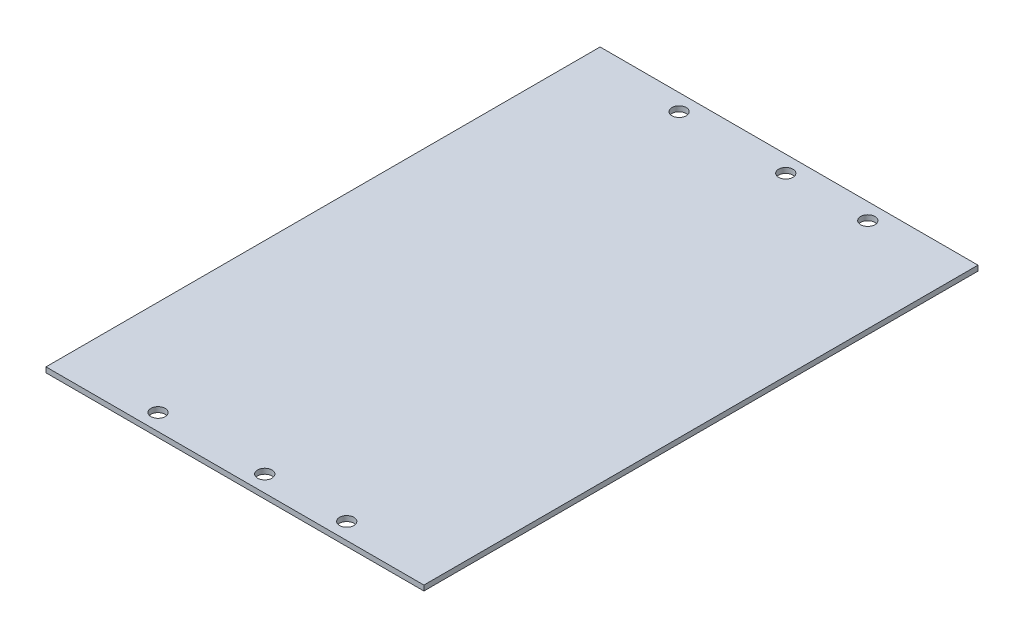
ISO-10303-21;
HEADER;
FILE_DESCRIPTION(('STEP AP214'),'2;1');
FILE_NAME('part.step','',(''),(''),'','','');
FILE_SCHEMA(('AUTOMOTIVE_DESIGN { 1 0 10303 214 1 1 1 1 }'));
ENDSEC;
DATA;
#1=APPLICATION_CONTEXT('core data for automotive mechanical design processes');
#2=APPLICATION_PROTOCOL_DEFINITION('international standard','automotive_design',2000,#1);
#3=PRODUCT_CONTEXT('',#1,'mechanical');
#4=PRODUCT('Part','Part','',(#3));
#5=PRODUCT_RELATED_PRODUCT_CATEGORY('part','',(#4));
#6=PRODUCT_DEFINITION_FORMATION('','',#4);
#7=PRODUCT_DEFINITION_CONTEXT('part definition',#1,'design');
#8=PRODUCT_DEFINITION('design','',#6,#7);
#9=PRODUCT_DEFINITION_SHAPE('','',#8);
#10=(LENGTH_UNIT() NAMED_UNIT(*) SI_UNIT(.MILLI.,.METRE.));
#11=(NAMED_UNIT(*) PLANE_ANGLE_UNIT() SI_UNIT($,.RADIAN.));
#12=(NAMED_UNIT(*) SI_UNIT($,.STERADIAN.) SOLID_ANGLE_UNIT());
#13=UNCERTAINTY_MEASURE_WITH_UNIT(LENGTH_MEASURE(1.E-05),#10,'distance_accuracy_value','');
#14=(GEOMETRIC_REPRESENTATION_CONTEXT(3) GLOBAL_UNCERTAINTY_ASSIGNED_CONTEXT((#13)) GLOBAL_UNIT_ASSIGNED_CONTEXT((#10,
#11,#12)) REPRESENTATION_CONTEXT('',''));
#15=CARTESIAN_POINT('',(0.,0.,0.));
#16=DIRECTION('',(0.,0.,1.));
#17=DIRECTION('',(1.,0.,0.));
#18=AXIS2_PLACEMENT_3D('',#15,#16,#17);
#19=CARTESIAN_POINT('',(0.,2.,0.));
#20=DIRECTION('',(0.,-1.,0.));
#21=DIRECTION('',(0.,0.,-1.));
#22=AXIS2_PLACEMENT_3D('',#19,#20,#21);
#23=PLANE('',#22);
#24=DIRECTION('',(0.,0.,1.));
#25=VECTOR('',#24,1.);
#26=CARTESIAN_POINT('',(5.70000000000018,2.,-1.4050000000001));
#27=LINE('',#26,#25);
#28=CARTESIAN_POINT('',(5.70000000000028,2.,-214.3));
#29=VERTEX_POINT('',#28);
#30=CARTESIAN_POINT('',(5.70000000000018,2.,-1.4050000000001));
#31=VERTEX_POINT('',#30);
#32=EDGE_CURVE('E91',#29,#31,#27,.T.);
#33=ORIENTED_EDGE('',*,*,#32,.T.);
#34=DIRECTION('',(1.,0.,0.));
#35=VECTOR('',#34,1.);
#36=CARTESIAN_POINT('',(5.70000000000018,2.,-1.4050000000001));
#37=LINE('',#36,#35);
#38=CARTESIAN_POINT('',(150.9,2.,-1.4050000000001));
#39=VERTEX_POINT('',#38);
#40=EDGE_CURVE('E86',#31,#39,#37,.T.);
#41=ORIENTED_EDGE('',*,*,#40,.T.);
#42=DIRECTION('',(0.,0.,-1.));
#43=VECTOR('',#42,1.);
#44=CARTESIAN_POINT('',(150.9,2.,-1.4050000000001));
#45=LINE('',#44,#43);
#46=CARTESIAN_POINT('',(150.9,2.,-214.3));
#47=VERTEX_POINT('',#46);
#48=EDGE_CURVE('E89',#39,#47,#45,.T.);
#49=ORIENTED_EDGE('',*,*,#48,.T.);
#50=DIRECTION('',(-1.,0.,0.));
#51=VECTOR('',#50,1.);
#52=CARTESIAN_POINT('',(5.70000000000028,2.,-214.3));
#53=LINE('',#52,#51);
#54=EDGE_CURVE('E56',#47,#29,#53,.T.);
#55=ORIENTED_EDGE('',*,*,#54,.T.);
#56=EDGE_LOOP('',(#33,#41,#49,#55));
#57=FACE_BOUND('',#56,.T.);
#58=CARTESIAN_POINT('',(42.4000000000003,2.,-207.95));
#59=DIRECTION('',(0.,1.,0.));
#60=DIRECTION('',(0.,0.,1.));
#61=AXIS2_PLACEMENT_3D('',#58,#59,#60);
#62=CIRCLE('',#61,2.75);
#63=CARTESIAN_POINT('',(42.4000000000003,2.,-205.2));
#64=VERTEX_POINT('',#63);
#65=EDGE_CURVE('E106',#64,#64,#62,.T.);
#66=ORIENTED_EDGE('',*,*,#65,.F.);
#67=EDGE_LOOP('',(#66));
#68=FACE_BOUND('',#67,.T.);
#69=CARTESIAN_POINT('',(83.4000000000002,2.,-207.95));
#70=DIRECTION('',(0.,1.,0.));
#71=DIRECTION('',(0.,0.,1.));
#72=AXIS2_PLACEMENT_3D('',#69,#70,#71);
#73=CIRCLE('',#72,2.75000000000001);
#74=CARTESIAN_POINT('',(83.4000000000002,2.,-205.2));
#75=VERTEX_POINT('',#74);
#76=EDGE_CURVE('E121',#75,#75,#73,.T.);
#77=ORIENTED_EDGE('',*,*,#76,.F.);
#78=EDGE_LOOP('',(#77));
#79=FACE_BOUND('',#78,.T.);
#80=CARTESIAN_POINT('',(114.9,2.,-207.95));
#81=DIRECTION('',(0.,1.,0.));
#82=DIRECTION('',(0.,0.,1.));
#83=AXIS2_PLACEMENT_3D('',#80,#81,#82);
#84=CIRCLE('',#83,2.75000000000001);
#85=CARTESIAN_POINT('',(114.9,2.,-205.2));
#86=VERTEX_POINT('',#85);
#87=EDGE_CURVE('E127',#86,#86,#84,.T.);
#88=ORIENTED_EDGE('',*,*,#87,.F.);
#89=EDGE_LOOP('',(#88));
#90=FACE_BOUND('',#89,.T.);
#91=CARTESIAN_POINT('',(114.9,2.,-7.75500000000012));
#92=DIRECTION('',(0.,1.,0.));
#93=DIRECTION('',(0.,0.,-1.));
#94=AXIS2_PLACEMENT_3D('',#91,#92,#93);
#95=CIRCLE('',#94,2.75000000000001);
#96=CARTESIAN_POINT('',(114.9,2.,-10.5050000000001));
#97=VERTEX_POINT('',#96);
#98=EDGE_CURVE('E133',#97,#97,#95,.T.);
#99=ORIENTED_EDGE('',*,*,#98,.F.);
#100=EDGE_LOOP('',(#99));
#101=FACE_BOUND('',#100,.T.);
#102=CARTESIAN_POINT('',(83.4000000000001,2.,-7.75500000000012));
#103=DIRECTION('',(0.,1.,0.));
#104=DIRECTION('',(0.,0.,-1.));
#105=AXIS2_PLACEMENT_3D('',#102,#103,#104);
#106=CIRCLE('',#105,2.75000000000001);
#107=CARTESIAN_POINT('',(83.4000000000001,2.,-10.5050000000001));
#108=VERTEX_POINT('',#107);
#109=EDGE_CURVE('E139',#108,#108,#106,.T.);
#110=ORIENTED_EDGE('',*,*,#109,.F.);
#111=EDGE_LOOP('',(#110));
#112=FACE_BOUND('',#111,.T.);
#113=CARTESIAN_POINT('',(42.4000000000003,2.,-7.75500000000012));
#114=DIRECTION('',(0.,1.,0.));
#115=DIRECTION('',(0.,0.,-1.));
#116=AXIS2_PLACEMENT_3D('',#113,#114,#115);
#117=CIRCLE('',#116,2.75);
#118=CARTESIAN_POINT('',(42.4000000000003,2.,-10.5050000000001));
#119=VERTEX_POINT('',#118);
#120=EDGE_CURVE('E145',#119,#119,#117,.T.);
#121=ORIENTED_EDGE('',*,*,#120,.F.);
#122=EDGE_LOOP('',(#121));
#123=FACE_BOUND('',#122,.T.);
#124=ADVANCED_FACE('F39',(#57,#68,#79,#90,#101,#112,#123),#23,.F.);
#125=CARTESIAN_POINT('',(0.,0.,0.));
#126=DIRECTION('',(0.,-1.,0.));
#127=DIRECTION('',(0.,0.,-1.));
#128=AXIS2_PLACEMENT_3D('',#125,#126,#127);
#129=PLANE('',#128);
#130=CARTESIAN_POINT('',(83.4000000000001,0.,-7.75500000000012));
#131=DIRECTION('',(0.,1.,0.));
#132=DIRECTION('',(0.,0.,-1.));
#133=AXIS2_PLACEMENT_3D('',#130,#131,#132);
#134=CIRCLE('',#133,2.75000000000001);
#135=CARTESIAN_POINT('',(83.4000000000001,0.,-10.5050000000001));
#136=VERTEX_POINT('',#135);
#137=EDGE_CURVE('E142',#136,#136,#134,.T.);
#138=ORIENTED_EDGE('',*,*,#137,.T.);
#139=EDGE_LOOP('',(#138));
#140=FACE_BOUND('',#139,.T.);
#141=CARTESIAN_POINT('',(114.9,0.,-207.95));
#142=DIRECTION('',(0.,1.,0.));
#143=DIRECTION('',(0.,0.,1.));
#144=AXIS2_PLACEMENT_3D('',#141,#142,#143);
#145=CIRCLE('',#144,2.75000000000001);
#146=CARTESIAN_POINT('',(114.9,0.,-205.2));
#147=VERTEX_POINT('',#146);
#148=EDGE_CURVE('E130',#147,#147,#145,.T.);
#149=ORIENTED_EDGE('',*,*,#148,.T.);
#150=EDGE_LOOP('',(#149));
#151=FACE_BOUND('',#150,.T.);
#152=CARTESIAN_POINT('',(42.4000000000003,0.,-207.95));
#153=DIRECTION('',(0.,1.,0.));
#154=DIRECTION('',(0.,0.,1.));
#155=AXIS2_PLACEMENT_3D('',#152,#153,#154);
#156=CIRCLE('',#155,2.75);
#157=CARTESIAN_POINT('',(42.4000000000003,0.,-205.2));
#158=VERTEX_POINT('',#157);
#159=EDGE_CURVE('E118',#158,#158,#156,.T.);
#160=ORIENTED_EDGE('',*,*,#159,.T.);
#161=EDGE_LOOP('',(#160));
#162=FACE_BOUND('',#161,.T.);
#163=DIRECTION('',(0.,0.,1.));
#164=VECTOR('',#163,1.);
#165=CARTESIAN_POINT('',(5.70000000000018,0.,-1.4050000000001));
#166=LINE('',#165,#164);
#167=CARTESIAN_POINT('',(5.70000000000028,0.,-214.3));
#168=VERTEX_POINT('',#167);
#169=CARTESIAN_POINT('',(5.70000000000018,0.,-1.4050000000001));
#170=VERTEX_POINT('',#169);
#171=EDGE_CURVE('E103',#168,#170,#166,.T.);
#172=ORIENTED_EDGE('',*,*,#171,.F.);
#173=DIRECTION('',(-1.,0.,0.));
#174=VECTOR('',#173,1.);
#175=CARTESIAN_POINT('',(5.70000000000028,0.,-214.3));
#176=LINE('',#175,#174);
#177=CARTESIAN_POINT('',(150.9,0.,-214.3));
#178=VERTEX_POINT('',#177);
#179=EDGE_CURVE('E79',#178,#168,#176,.T.);
#180=ORIENTED_EDGE('',*,*,#179,.F.);
#181=DIRECTION('',(0.,0.,-1.));
#182=VECTOR('',#181,1.);
#183=CARTESIAN_POINT('',(150.9,0.,-1.4050000000001));
#184=LINE('',#183,#182);
#185=CARTESIAN_POINT('',(150.9,0.,-1.4050000000001));
#186=VERTEX_POINT('',#185);
#187=EDGE_CURVE('E73',#186,#178,#184,.T.);
#188=ORIENTED_EDGE('',*,*,#187,.F.);
#189=DIRECTION('',(1.,0.,0.));
#190=VECTOR('',#189,1.);
#191=CARTESIAN_POINT('',(5.70000000000018,0.,-1.4050000000001));
#192=LINE('',#191,#190);
#193=EDGE_CURVE('E95',#170,#186,#192,.T.);
#194=ORIENTED_EDGE('',*,*,#193,.F.);
#195=EDGE_LOOP('',(#172,#180,#188,#194));
#196=FACE_BOUND('',#195,.T.);
#197=CARTESIAN_POINT('',(83.4000000000002,0.,-207.95));
#198=DIRECTION('',(0.,1.,0.));
#199=DIRECTION('',(0.,0.,1.));
#200=AXIS2_PLACEMENT_3D('',#197,#198,#199);
#201=CIRCLE('',#200,2.75000000000001);
#202=CARTESIAN_POINT('',(83.4000000000002,0.,-205.2));
#203=VERTEX_POINT('',#202);
#204=EDGE_CURVE('E124',#203,#203,#201,.T.);
#205=ORIENTED_EDGE('',*,*,#204,.T.);
#206=EDGE_LOOP('',(#205));
#207=FACE_BOUND('',#206,.T.);
#208=CARTESIAN_POINT('',(114.9,0.,-7.75500000000012));
#209=DIRECTION('',(0.,1.,0.));
#210=DIRECTION('',(0.,0.,-1.));
#211=AXIS2_PLACEMENT_3D('',#208,#209,#210);
#212=CIRCLE('',#211,2.75000000000001);
#213=CARTESIAN_POINT('',(114.9,0.,-10.5050000000001));
#214=VERTEX_POINT('',#213);
#215=EDGE_CURVE('E136',#214,#214,#212,.T.);
#216=ORIENTED_EDGE('',*,*,#215,.T.);
#217=EDGE_LOOP('',(#216));
#218=FACE_BOUND('',#217,.T.);
#219=CARTESIAN_POINT('',(42.4000000000003,0.,-7.75500000000012));
#220=DIRECTION('',(0.,1.,0.));
#221=DIRECTION('',(0.,0.,-1.));
#222=AXIS2_PLACEMENT_3D('',#219,#220,#221);
#223=CIRCLE('',#222,2.75);
#224=CARTESIAN_POINT('',(42.4000000000003,0.,-10.5050000000001));
#225=VERTEX_POINT('',#224);
#226=EDGE_CURVE('E148',#225,#225,#223,.T.);
#227=ORIENTED_EDGE('',*,*,#226,.T.);
#228=EDGE_LOOP('',(#227));
#229=FACE_BOUND('',#228,.T.);
#230=ADVANCED_FACE('F114',(#140,#151,#162,#196,#207,#218,#229),#129,.T.);
#231=CARTESIAN_POINT('',(5.70000000000018,2.,-1.4050000000001));
#232=DIRECTION('',(1.,0.,0.));
#233=DIRECTION('',(0.,0.,-1.));
#234=AXIS2_PLACEMENT_3D('',#231,#232,#233);
#235=PLANE('',#234);
#236=ORIENTED_EDGE('',*,*,#171,.T.);
#237=DIRECTION('',(0.,-1.,0.));
#238=VECTOR('',#237,1.);
#239=CARTESIAN_POINT('',(5.70000000000018,2.,-1.4050000000001));
#240=LINE('',#239,#238);
#241=EDGE_CURVE('E11',#31,#170,#240,.T.);
#242=ORIENTED_EDGE('',*,*,#241,.F.);
#243=ORIENTED_EDGE('',*,*,#32,.F.);
#244=DIRECTION('',(0.,-1.,0.));
#245=VECTOR('',#244,1.);
#246=CARTESIAN_POINT('',(5.70000000000028,2.,-214.3));
#247=LINE('',#246,#245);
#248=EDGE_CURVE('E99',#29,#168,#247,.T.);
#249=ORIENTED_EDGE('',*,*,#248,.T.);
#250=EDGE_LOOP('',(#236,#242,#243,#249));
#251=FACE_BOUND('',#250,.T.);
#252=ADVANCED_FACE('F41',(#251),#235,.F.);
#253=CARTESIAN_POINT('',(5.70000000000018,2.,-1.4050000000001));
#254=DIRECTION('',(0.,0.,-1.));
#255=DIRECTION('',(-1.,0.,0.));
#256=AXIS2_PLACEMENT_3D('',#253,#254,#255);
#257=PLANE('',#256);
#258=ORIENTED_EDGE('',*,*,#193,.T.);
#259=DIRECTION('',(0.,-1.,0.));
#260=VECTOR('',#259,1.);
#261=CARTESIAN_POINT('',(150.9,2.,-1.4050000000001));
#262=LINE('',#261,#260);
#263=EDGE_CURVE('E48',#39,#186,#262,.T.);
#264=ORIENTED_EDGE('',*,*,#263,.F.);
#265=ORIENTED_EDGE('',*,*,#40,.F.);
#266=ORIENTED_EDGE('',*,*,#241,.T.);
#267=EDGE_LOOP('',(#258,#264,#265,#266));
#268=FACE_BOUND('',#267,.T.);
#269=ADVANCED_FACE('F94',(#268),#257,.F.);
#270=CARTESIAN_POINT('',(150.9,2.,-1.4050000000001));
#271=DIRECTION('',(-1.,0.,0.));
#272=DIRECTION('',(0.,0.,1.));
#273=AXIS2_PLACEMENT_3D('',#270,#271,#272);
#274=PLANE('',#273);
#275=ORIENTED_EDGE('',*,*,#187,.T.);
#276=DIRECTION('',(0.,-1.,0.));
#277=VECTOR('',#276,1.);
#278=CARTESIAN_POINT('',(150.9,2.,-214.3));
#279=LINE('',#278,#277);
#280=EDGE_CURVE('E96',#47,#178,#279,.T.);
#281=ORIENTED_EDGE('',*,*,#280,.F.);
#282=ORIENTED_EDGE('',*,*,#48,.F.);
#283=ORIENTED_EDGE('',*,*,#263,.T.);
#284=EDGE_LOOP('',(#275,#281,#282,#283));
#285=FACE_BOUND('',#284,.T.);
#286=ADVANCED_FACE('F97',(#285),#274,.F.);
#287=CARTESIAN_POINT('',(5.70000000000028,2.,-214.3));
#288=DIRECTION('',(0.,0.,1.));
#289=DIRECTION('',(1.,0.,0.));
#290=AXIS2_PLACEMENT_3D('',#287,#288,#289);
#291=PLANE('',#290);
#292=ORIENTED_EDGE('',*,*,#179,.T.);
#293=ORIENTED_EDGE('',*,*,#248,.F.);
#294=ORIENTED_EDGE('',*,*,#54,.F.);
#295=ORIENTED_EDGE('',*,*,#280,.T.);
#296=EDGE_LOOP('',(#292,#293,#294,#295));
#297=FACE_BOUND('',#296,.T.);
#298=ADVANCED_FACE('F111',(#297),#291,.F.);
#299=CARTESIAN_POINT('',(42.4000000000003,2.,-207.95));
#300=DIRECTION('',(0.,-1.,0.));
#301=DIRECTION('',(0.,0.,-1.));
#302=AXIS2_PLACEMENT_3D('',#299,#300,#301);
#303=CYLINDRICAL_SURFACE('',#302,2.75);
#304=ORIENTED_EDGE('',*,*,#65,.T.);
#305=EDGE_LOOP('',(#304));
#306=FACE_BOUND('',#305,.T.);
#307=ORIENTED_EDGE('',*,*,#159,.F.);
#308=EDGE_LOOP('',(#307));
#309=FACE_BOUND('',#308,.T.);
#310=ADVANCED_FACE('F165',(#306,#309),#303,.F.);
#311=CARTESIAN_POINT('',(83.4000000000002,2.,-207.95));
#312=DIRECTION('',(0.,-1.,0.));
#313=DIRECTION('',(0.,0.,-1.));
#314=AXIS2_PLACEMENT_3D('',#311,#312,#313);
#315=CYLINDRICAL_SURFACE('',#314,2.75000000000001);
#316=ORIENTED_EDGE('',*,*,#76,.T.);
#317=EDGE_LOOP('',(#316));
#318=FACE_BOUND('',#317,.T.);
#319=ORIENTED_EDGE('',*,*,#204,.F.);
#320=EDGE_LOOP('',(#319));
#321=FACE_BOUND('',#320,.T.);
#322=ADVANCED_FACE('F210',(#318,#321),#315,.F.);
#323=CARTESIAN_POINT('',(114.9,2.,-207.95));
#324=DIRECTION('',(0.,-1.,0.));
#325=DIRECTION('',(0.,0.,-1.));
#326=AXIS2_PLACEMENT_3D('',#323,#324,#325);
#327=CYLINDRICAL_SURFACE('',#326,2.75000000000001);
#328=ORIENTED_EDGE('',*,*,#87,.T.);
#329=EDGE_LOOP('',(#328));
#330=FACE_BOUND('',#329,.T.);
#331=ORIENTED_EDGE('',*,*,#148,.F.);
#332=EDGE_LOOP('',(#331));
#333=FACE_BOUND('',#332,.T.);
#334=ADVANCED_FACE('F218',(#330,#333),#327,.F.);
#335=CARTESIAN_POINT('',(114.9,2.,-7.75500000000012));
#336=DIRECTION('',(0.,-1.,0.));
#337=DIRECTION('',(0.,0.,-1.));
#338=AXIS2_PLACEMENT_3D('',#335,#336,#337);
#339=CYLINDRICAL_SURFACE('',#338,2.75000000000001);
#340=ORIENTED_EDGE('',*,*,#98,.T.);
#341=EDGE_LOOP('',(#340));
#342=FACE_BOUND('',#341,.T.);
#343=ORIENTED_EDGE('',*,*,#215,.F.);
#344=EDGE_LOOP('',(#343));
#345=FACE_BOUND('',#344,.T.);
#346=ADVANCED_FACE('F226',(#342,#345),#339,.F.);
#347=CARTESIAN_POINT('',(83.4000000000001,2.,-7.75500000000012));
#348=DIRECTION('',(0.,-1.,0.));
#349=DIRECTION('',(0.,0.,-1.));
#350=AXIS2_PLACEMENT_3D('',#347,#348,#349);
#351=CYLINDRICAL_SURFACE('',#350,2.75000000000001);
#352=ORIENTED_EDGE('',*,*,#109,.T.);
#353=EDGE_LOOP('',(#352));
#354=FACE_BOUND('',#353,.T.);
#355=ORIENTED_EDGE('',*,*,#137,.F.);
#356=EDGE_LOOP('',(#355));
#357=FACE_BOUND('',#356,.T.);
#358=ADVANCED_FACE('F235',(#354,#357),#351,.F.);
#359=CARTESIAN_POINT('',(42.4000000000003,2.,-7.75500000000012));
#360=DIRECTION('',(0.,-1.,0.));
#361=DIRECTION('',(0.,0.,-1.));
#362=AXIS2_PLACEMENT_3D('',#359,#360,#361);
#363=CYLINDRICAL_SURFACE('',#362,2.75);
#364=ORIENTED_EDGE('',*,*,#120,.T.);
#365=EDGE_LOOP('',(#364));
#366=FACE_BOUND('',#365,.T.);
#367=ORIENTED_EDGE('',*,*,#226,.F.);
#368=EDGE_LOOP('',(#367));
#369=FACE_BOUND('',#368,.T.);
#370=ADVANCED_FACE('F154',(#366,#369),#363,.F.);
#371=CLOSED_SHELL('',(#124,#230,#252,#269,#286,#298,#310,#322,#334,#346,#358,#370));
#372=MANIFOLD_SOLID_BREP('B2',#371);
#373=ADVANCED_BREP_SHAPE_REPRESENTATION('',(#18,#372),#14);
#374=SHAPE_DEFINITION_REPRESENTATION(#9,#373);
ENDSEC;
END-ISO-10303-21;
